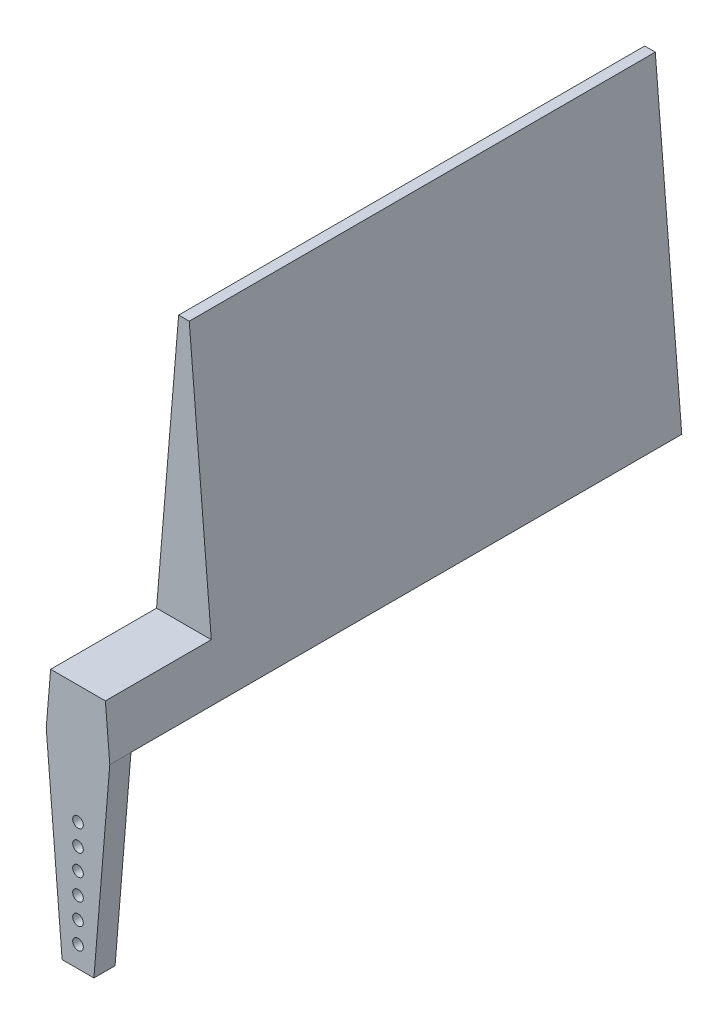
ISO-10303-21;
HEADER;
FILE_DESCRIPTION(('STEP AP214'),'2;1');
FILE_NAME('part.step','',(''),(''),'','','');
FILE_SCHEMA(('AUTOMOTIVE_DESIGN { 1 0 10303 214 1 1 1 1 }'));
ENDSEC;
DATA;
#1=APPLICATION_CONTEXT('core data for automotive mechanical design processes');
#2=APPLICATION_PROTOCOL_DEFINITION('international standard','automotive_design',2000,#1);
#3=PRODUCT_CONTEXT('',#1,'mechanical');
#4=PRODUCT('Part','Part','',(#3));
#5=PRODUCT_RELATED_PRODUCT_CATEGORY('part','',(#4));
#6=PRODUCT_DEFINITION_FORMATION('','',#4);
#7=PRODUCT_DEFINITION_CONTEXT('part definition',#1,'design');
#8=PRODUCT_DEFINITION('design','',#6,#7);
#9=PRODUCT_DEFINITION_SHAPE('','',#8);
#10=(LENGTH_UNIT() NAMED_UNIT(*) SI_UNIT(.MILLI.,.METRE.));
#11=(NAMED_UNIT(*) PLANE_ANGLE_UNIT() SI_UNIT($,.RADIAN.));
#12=(NAMED_UNIT(*) SI_UNIT($,.STERADIAN.) SOLID_ANGLE_UNIT());
#13=UNCERTAINTY_MEASURE_WITH_UNIT(LENGTH_MEASURE(1.E-05),#10,'distance_accuracy_value','');
#14=(GEOMETRIC_REPRESENTATION_CONTEXT(3) GLOBAL_UNCERTAINTY_ASSIGNED_CONTEXT((#13)) GLOBAL_UNIT_ASSIGNED_CONTEXT((#10,
#11,#12)) REPRESENTATION_CONTEXT('',''));
#15=CARTESIAN_POINT('',(0.,0.,0.));
#16=DIRECTION('',(0.,0.,1.));
#17=DIRECTION('',(1.,0.,0.));
#18=AXIS2_PLACEMENT_3D('',#15,#16,#17);
#19=CARTESIAN_POINT('',(60.5722359618717,20.7278633503816,-44.));
#20=DIRECTION('',(0.,-1.,0.));
#21=DIRECTION('',(0.,0.,-1.));
#22=AXIS2_PLACEMENT_3D('',#19,#20,#21);
#23=PLANE('',#22);
#24=DIRECTION('',(0.,0.,1.));
#25=VECTOR('',#24,1.);
#26=CARTESIAN_POINT('',(66.5722359618717,20.7278633503816,-44.));
#27=LINE('',#26,#25);
#28=CARTESIAN_POINT('',(66.5722359618717,20.7278633503816,-44.));
#29=VERTEX_POINT('',#28);
#30=CARTESIAN_POINT('',(66.5722359618717,20.7278633503816,8.));
#31=VERTEX_POINT('',#30);
#32=EDGE_CURVE('E45',#29,#31,#27,.T.);
#33=ORIENTED_EDGE('',*,*,#32,.T.);
#34=DIRECTION('',(-1.,0.,0.));
#35=VECTOR('',#34,1.);
#36=CARTESIAN_POINT('',(66.5722359618717,20.7278633503816,8.));
#37=LINE('',#36,#35);
#38=CARTESIAN_POINT('',(60.5722359618717,20.7278633503816,8.));
#39=VERTEX_POINT('',#38);
#40=EDGE_CURVE('E122',#31,#39,#37,.T.);
#41=ORIENTED_EDGE('',*,*,#40,.T.);
#42=DIRECTION('',(0.,0.,1.));
#43=VECTOR('',#42,1.);
#44=CARTESIAN_POINT('',(60.5722359618717,20.7278633503816,-44.));
#45=LINE('',#44,#43);
#46=CARTESIAN_POINT('',(60.5722359618717,20.7278633503816,-44.));
#47=VERTEX_POINT('',#46);
#48=EDGE_CURVE('E11',#47,#39,#45,.T.);
#49=ORIENTED_EDGE('',*,*,#48,.F.);
#50=DIRECTION('',(1.,0.,0.));
#51=VECTOR('',#50,1.);
#52=CARTESIAN_POINT('',(60.5722359618717,20.7278633503816,-44.));
#53=LINE('',#52,#51);
#54=EDGE_CURVE('E165',#47,#29,#53,.T.);
#55=ORIENTED_EDGE('',*,*,#54,.T.);
#56=EDGE_LOOP('',(#33,#41,#49,#55));
#57=FACE_BOUND('',#56,.T.);
#58=ADVANCED_FACE('F39',(#57),#23,.T.);
#59=CARTESIAN_POINT('',(0.,0.,0.));
#60=DIRECTION('',(0.,0.,-1.));
#61=DIRECTION('',(-1.,0.,0.));
#62=AXIS2_PLACEMENT_3D('',#59,#60,#61);
#63=PLANE('',#62);
#64=DIRECTION('',(-1.,0.,0.));
#65=VECTOR('',#64,1.);
#66=CARTESIAN_POINT('',(60.9889026285384,25.7278633503816,0.));
#67=LINE('',#66,#65);
#68=CARTESIAN_POINT('',(66.1555692952051,25.7278633503816,0.));
#69=VERTEX_POINT('',#68);
#70=CARTESIAN_POINT('',(60.9889026285384,25.7278633503816,0.));
#71=VERTEX_POINT('',#70);
#72=EDGE_CURVE('E64',#69,#71,#67,.T.);
#73=ORIENTED_EDGE('',*,*,#72,.F.);
#74=DIRECTION('',(-0.08304547985374,0.99654575824488,0.));
#75=VECTOR('',#74,1.);
#76=CARTESIAN_POINT('',(64.0722359618717,50.7278633503816,0.));
#77=LINE('',#76,#75);
#78=CARTESIAN_POINT('',(64.0722359618717,50.7278633503816,0.));
#79=VERTEX_POINT('',#78);
#80=EDGE_CURVE('E161',#69,#79,#77,.T.);
#81=ORIENTED_EDGE('',*,*,#80,.T.);
#82=DIRECTION('',(-1.,0.,0.));
#83=VECTOR('',#82,1.);
#84=CARTESIAN_POINT('',(63.0722359618717,50.7278633503816,0.));
#85=LINE('',#84,#83);
#86=CARTESIAN_POINT('',(63.0722359618717,50.7278633503816,0.));
#87=VERTEX_POINT('',#86);
#88=EDGE_CURVE('E178',#79,#87,#85,.T.);
#89=ORIENTED_EDGE('',*,*,#88,.T.);
#90=DIRECTION('',(-0.08304547985374,-0.99654575824488,0.));
#91=VECTOR('',#90,1.);
#92=CARTESIAN_POINT('',(63.0722359618717,50.7278633503816,0.));
#93=LINE('',#92,#91);
#94=EDGE_CURVE('E166',#87,#71,#93,.T.);
#95=ORIENTED_EDGE('',*,*,#94,.T.);
#96=EDGE_LOOP('',(#73,#81,#89,#95));
#97=FACE_BOUND('',#96,.T.);
#98=ADVANCED_FACE('F197',(#97),#63,.F.);
#99=CARTESIAN_POINT('',(63.0722359618717,50.7278633503816,-44.));
#100=DIRECTION('',(-0.99654575824488,0.0830454798537401,0.));
#101=DIRECTION('',(-0.08304547985374,-0.99654575824488,0.));
#102=AXIS2_PLACEMENT_3D('',#99,#100,#101);
#103=PLANE('',#102);
#104=ORIENTED_EDGE('',*,*,#94,.F.);
#105=DIRECTION('',(0.,0.,1.));
#106=VECTOR('',#105,1.);
#107=CARTESIAN_POINT('',(63.0722359618717,50.7278633503816,-44.));
#108=LINE('',#107,#106);
#109=CARTESIAN_POINT('',(63.0722359618717,50.7278633503816,-44.));
#110=VERTEX_POINT('',#109);
#111=EDGE_CURVE('E50',#110,#87,#108,.T.);
#112=ORIENTED_EDGE('',*,*,#111,.F.);
#113=DIRECTION('',(-0.08304547985374,-0.99654575824488,0.));
#114=VECTOR('',#113,1.);
#115=CARTESIAN_POINT('',(63.0722359618717,50.7278633503816,-44.));
#116=LINE('',#115,#114);
#117=EDGE_CURVE('E172',#110,#47,#116,.T.);
#118=ORIENTED_EDGE('',*,*,#117,.T.);
#119=ORIENTED_EDGE('',*,*,#48,.T.);
#120=DIRECTION('',(0.,0.,1.));
#121=VECTOR('',#120,1.);
#122=CARTESIAN_POINT('',(60.5722359618717,20.7278633503816,8.));
#123=LINE('',#122,#121);
#124=CARTESIAN_POINT('',(60.5722359618717,20.7278633503816,10.));
#125=VERTEX_POINT('',#124);
#126=EDGE_CURVE('E126',#39,#125,#123,.T.);
#127=ORIENTED_EDGE('',*,*,#126,.T.);
#128=DIRECTION('',(-0.0830454798537391,-0.99654575824488,0.));
#129=VECTOR('',#128,1.);
#130=CARTESIAN_POINT('',(60.5722359618717,20.7278633503816,10.));
#131=LINE('',#130,#129);
#132=CARTESIAN_POINT('',(60.9889026285384,25.7278633503816,10.));
#133=VERTEX_POINT('',#132);
#134=EDGE_CURVE('E155',#133,#125,#131,.T.);
#135=ORIENTED_EDGE('',*,*,#134,.F.);
#136=DIRECTION('',(0.,0.,-1.));
#137=VECTOR('',#136,1.);
#138=CARTESIAN_POINT('',(60.9889026285384,25.7278633503816,10.));
#139=LINE('',#138,#137);
#140=EDGE_CURVE('E156',#133,#71,#139,.T.);
#141=ORIENTED_EDGE('',*,*,#140,.T.);
#142=EDGE_LOOP('',(#104,#112,#118,#119,#127,#135,#141));
#143=FACE_BOUND('',#142,.T.);
#144=ADVANCED_FACE('F202',(#143),#103,.T.);
#145=CARTESIAN_POINT('',(63.0722359618717,50.7278633503816,-44.));
#146=DIRECTION('',(0.,1.,0.));
#147=DIRECTION('',(-1.,0.,0.));
#148=AXIS2_PLACEMENT_3D('',#145,#146,#147);
#149=PLANE('',#148);
#150=ORIENTED_EDGE('',*,*,#88,.F.);
#151=DIRECTION('',(0.,0.,1.));
#152=VECTOR('',#151,1.);
#153=CARTESIAN_POINT('',(64.0722359618717,50.7278633503816,-44.));
#154=LINE('',#153,#152);
#155=CARTESIAN_POINT('',(64.0722359618717,50.7278633503816,-44.));
#156=VERTEX_POINT('',#155);
#157=EDGE_CURVE('E185',#156,#79,#154,.T.);
#158=ORIENTED_EDGE('',*,*,#157,.F.);
#159=DIRECTION('',(-1.,0.,0.));
#160=VECTOR('',#159,1.);
#161=CARTESIAN_POINT('',(63.0722359618717,50.7278633503816,-44.));
#162=LINE('',#161,#160);
#163=EDGE_CURVE('E171',#156,#110,#162,.T.);
#164=ORIENTED_EDGE('',*,*,#163,.T.);
#165=ORIENTED_EDGE('',*,*,#111,.T.);
#166=EDGE_LOOP('',(#150,#158,#164,#165));
#167=FACE_BOUND('',#166,.T.);
#168=ADVANCED_FACE('F200',(#167),#149,.T.);
#169=CARTESIAN_POINT('',(64.0722359618717,50.7278633503816,-44.));
#170=DIRECTION('',(0.99654575824488,0.08304547985374,0.));
#171=DIRECTION('',(-0.08304547985374,0.99654575824488,0.));
#172=AXIS2_PLACEMENT_3D('',#169,#170,#171);
#173=PLANE('',#172);
#174=ORIENTED_EDGE('',*,*,#80,.F.);
#175=DIRECTION('',(0.,0.,-1.));
#176=VECTOR('',#175,1.);
#177=CARTESIAN_POINT('',(66.1555692952051,25.7278633503816,10.));
#178=LINE('',#177,#176);
#179=CARTESIAN_POINT('',(66.1555692952051,25.7278633503816,10.));
#180=VERTEX_POINT('',#179);
#181=EDGE_CURVE('E160',#180,#69,#178,.T.);
#182=ORIENTED_EDGE('',*,*,#181,.F.);
#183=DIRECTION('',(-0.0830454798537418,0.99654575824488,0.));
#184=VECTOR('',#183,1.);
#185=CARTESIAN_POINT('',(66.1555692952051,25.7278633503816,10.));
#186=LINE('',#185,#184);
#187=CARTESIAN_POINT('',(66.5722359618717,20.7278633503816,10.));
#188=VERTEX_POINT('',#187);
#189=EDGE_CURVE('E146',#188,#180,#186,.T.);
#190=ORIENTED_EDGE('',*,*,#189,.F.);
#191=DIRECTION('',(0.,0.,1.));
#192=VECTOR('',#191,1.);
#193=CARTESIAN_POINT('',(66.5722359618717,20.7278633503816,8.));
#194=LINE('',#193,#192);
#195=EDGE_CURVE('E147',#31,#188,#194,.T.);
#196=ORIENTED_EDGE('',*,*,#195,.F.);
#197=ORIENTED_EDGE('',*,*,#32,.F.);
#198=DIRECTION('',(-0.08304547985374,0.99654575824488,0.));
#199=VECTOR('',#198,1.);
#200=CARTESIAN_POINT('',(64.0722359618717,50.7278633503816,-44.));
#201=LINE('',#200,#199);
#202=EDGE_CURVE('E170',#29,#156,#201,.T.);
#203=ORIENTED_EDGE('',*,*,#202,.T.);
#204=ORIENTED_EDGE('',*,*,#157,.T.);
#205=EDGE_LOOP('',(#174,#182,#190,#196,#197,#203,#204));
#206=FACE_BOUND('',#205,.T.);
#207=ADVANCED_FACE('F192',(#206),#173,.T.);
#208=CARTESIAN_POINT('',(0.,0.,-44.));
#209=DIRECTION('',(0.,0.,-1.));
#210=DIRECTION('',(-1.,0.,0.));
#211=AXIS2_PLACEMENT_3D('',#208,#209,#210);
#212=PLANE('',#211);
#213=ORIENTED_EDGE('',*,*,#54,.F.);
#214=ORIENTED_EDGE('',*,*,#117,.F.);
#215=ORIENTED_EDGE('',*,*,#163,.F.);
#216=ORIENTED_EDGE('',*,*,#202,.F.);
#217=EDGE_LOOP('',(#213,#214,#215,#216));
#218=FACE_BOUND('',#217,.T.);
#219=ADVANCED_FACE('F193',(#218),#212,.T.);
#220=CARTESIAN_POINT('',(60.9889026285384,25.7278633503816,10.));
#221=DIRECTION('',(0.,-1.,0.));
#222=DIRECTION('',(0.,0.,-1.));
#223=AXIS2_PLACEMENT_3D('',#220,#221,#222);
#224=PLANE('',#223);
#225=ORIENTED_EDGE('',*,*,#72,.T.);
#226=ORIENTED_EDGE('',*,*,#140,.F.);
#227=DIRECTION('',(-1.,0.,0.));
#228=VECTOR('',#227,1.);
#229=CARTESIAN_POINT('',(60.9889026285384,25.7278633503816,10.));
#230=LINE('',#229,#228);
#231=EDGE_CURVE('E154',#180,#133,#230,.T.);
#232=ORIENTED_EDGE('',*,*,#231,.F.);
#233=ORIENTED_EDGE('',*,*,#181,.T.);
#234=EDGE_LOOP('',(#225,#226,#232,#233));
#235=FACE_BOUND('',#234,.T.);
#236=ADVANCED_FACE('F210',(#235),#224,.F.);
#237=CARTESIAN_POINT('',(0.,0.,10.));
#238=DIRECTION('',(0.,0.,-1.));
#239=DIRECTION('',(-1.,0.,0.));
#240=AXIS2_PLACEMENT_3D('',#237,#238,#239);
#241=PLANE('',#240);
#242=ORIENTED_EDGE('',*,*,#134,.T.);
#243=DIRECTION('',(0.0821390832087535,-0.996620876266209,0.));
#244=VECTOR('',#243,1.);
#245=CARTESIAN_POINT('',(60.5722359618717,20.7278633503816,10.));
#246=LINE('',#245,#244);
#247=CARTESIAN_POINT('',(62.0722359618717,2.52786335038159,10.));
#248=VERTEX_POINT('',#247);
#249=EDGE_CURVE('E142',#125,#248,#246,.T.);
#250=ORIENTED_EDGE('',*,*,#249,.T.);
#251=DIRECTION('',(1.,0.,0.));
#252=VECTOR('',#251,1.);
#253=CARTESIAN_POINT('',(62.0722359618717,2.52786335038159,10.));
#254=LINE('',#253,#252);
#255=CARTESIAN_POINT('',(65.0722359618717,2.52786335038159,10.));
#256=VERTEX_POINT('',#255);
#257=EDGE_CURVE('E120',#248,#256,#254,.T.);
#258=ORIENTED_EDGE('',*,*,#257,.T.);
#259=DIRECTION('',(0.0821390832087535,0.996620876266209,0.));
#260=VECTOR('',#259,1.);
#261=CARTESIAN_POINT('',(65.0722359618717,2.52786335038159,10.));
#262=LINE('',#261,#260);
#263=EDGE_CURVE('E134',#256,#188,#262,.T.);
#264=ORIENTED_EDGE('',*,*,#263,.T.);
#265=ORIENTED_EDGE('',*,*,#189,.T.);
#266=ORIENTED_EDGE('',*,*,#231,.T.);
#267=EDGE_LOOP('',(#242,#250,#258,#264,#265,#266));
#268=FACE_BOUND('',#267,.T.);
#269=CARTESIAN_POINT('',(63.5722359618717,6.52786335038159,10.));
#270=DIRECTION('',(0.,0.,1.));
#271=DIRECTION('',(-1.,0.,0.));
#272=AXIS2_PLACEMENT_3D('',#269,#270,#271);
#273=CIRCLE('',#272,0.500000000002423);
#274=CARTESIAN_POINT('',(63.0722359618693,6.52786335038159,10.));
#275=VERTEX_POINT('',#274);
#276=EDGE_CURVE('E341',#275,#275,#273,.T.);
#277=ORIENTED_EDGE('',*,*,#276,.F.);
#278=EDGE_LOOP('',(#277));
#279=FACE_BOUND('',#278,.T.);
#280=CARTESIAN_POINT('',(63.5722359618717,4.52786335038159,10.));
#281=DIRECTION('',(0.,0.,1.));
#282=DIRECTION('',(-1.,0.,0.));
#283=AXIS2_PLACEMENT_3D('',#280,#281,#282);
#284=CIRCLE('',#283,0.500000000002423);
#285=CARTESIAN_POINT('',(63.0722359618693,4.52786335038159,10.));
#286=VERTEX_POINT('',#285);
#287=EDGE_CURVE('E349',#286,#286,#284,.T.);
#288=ORIENTED_EDGE('',*,*,#287,.F.);
#289=EDGE_LOOP('',(#288));
#290=FACE_BOUND('',#289,.T.);
#291=CARTESIAN_POINT('',(63.5722359618717,8.52786335038159,10.));
#292=DIRECTION('',(0.,0.,1.));
#293=DIRECTION('',(-1.,0.,0.));
#294=AXIS2_PLACEMENT_3D('',#291,#292,#293);
#295=CIRCLE('',#294,0.500000000002423);
#296=CARTESIAN_POINT('',(63.0722359618693,8.52786335038159,10.));
#297=VERTEX_POINT('',#296);
#298=EDGE_CURVE('E352',#297,#297,#295,.T.);
#299=ORIENTED_EDGE('',*,*,#298,.F.);
#300=EDGE_LOOP('',(#299));
#301=FACE_BOUND('',#300,.T.);
#302=CARTESIAN_POINT('',(63.5722359618717,10.5278633503816,10.));
#303=DIRECTION('',(0.,0.,1.));
#304=DIRECTION('',(-1.,0.,0.));
#305=AXIS2_PLACEMENT_3D('',#302,#303,#304);
#306=CIRCLE('',#305,0.500000000002423);
#307=CARTESIAN_POINT('',(63.0722359618693,10.5278633503816,10.));
#308=VERTEX_POINT('',#307);
#309=EDGE_CURVE('E356',#308,#308,#306,.T.);
#310=ORIENTED_EDGE('',*,*,#309,.F.);
#311=EDGE_LOOP('',(#310));
#312=FACE_BOUND('',#311,.T.);
#313=CARTESIAN_POINT('',(63.5722359618717,12.5278633503816,10.));
#314=DIRECTION('',(0.,0.,1.));
#315=DIRECTION('',(-1.,0.,0.));
#316=AXIS2_PLACEMENT_3D('',#313,#314,#315);
#317=CIRCLE('',#316,0.500000000002423);
#318=CARTESIAN_POINT('',(63.0722359618693,12.5278633503816,10.));
#319=VERTEX_POINT('',#318);
#320=EDGE_CURVE('E364',#319,#319,#317,.T.);
#321=ORIENTED_EDGE('',*,*,#320,.F.);
#322=EDGE_LOOP('',(#321));
#323=FACE_BOUND('',#322,.T.);
#324=CARTESIAN_POINT('',(63.5722359618717,14.5278633503816,10.));
#325=DIRECTION('',(0.,0.,1.));
#326=DIRECTION('',(-1.,0.,0.));
#327=AXIS2_PLACEMENT_3D('',#324,#325,#326);
#328=CIRCLE('',#327,0.500000000002423);
#329=CARTESIAN_POINT('',(63.0722359618693,14.5278633503816,10.));
#330=VERTEX_POINT('',#329);
#331=EDGE_CURVE('E136',#330,#330,#328,.T.);
#332=ORIENTED_EDGE('',*,*,#331,.F.);
#333=EDGE_LOOP('',(#332));
#334=FACE_BOUND('',#333,.T.);
#335=ADVANCED_FACE('F208',(#268,#279,#290,#301,#312,#323,#334),#241,.F.);
#336=CARTESIAN_POINT('',(60.5722359618717,20.7278633503816,8.));
#337=DIRECTION('',(-0.996620876266209,-0.0821390832087535,0.));
#338=DIRECTION('',(0.0821390832087535,-0.996620876266209,0.));
#339=AXIS2_PLACEMENT_3D('',#336,#337,#338);
#340=PLANE('',#339);
#341=ORIENTED_EDGE('',*,*,#249,.F.);
#342=ORIENTED_EDGE('',*,*,#126,.F.);
#343=DIRECTION('',(0.0821390832087535,-0.996620876266209,0.));
#344=VECTOR('',#343,1.);
#345=CARTESIAN_POINT('',(60.5722359618717,20.7278633503816,8.));
#346=LINE('',#345,#344);
#347=CARTESIAN_POINT('',(62.0722359618717,2.52786335038159,8.));
#348=VERTEX_POINT('',#347);
#349=EDGE_CURVE('E54',#39,#348,#346,.T.);
#350=ORIENTED_EDGE('',*,*,#349,.T.);
#351=DIRECTION('',(0.,0.,1.));
#352=VECTOR('',#351,1.);
#353=CARTESIAN_POINT('',(62.0722359618717,2.52786335038159,8.));
#354=LINE('',#353,#352);
#355=EDGE_CURVE('E113',#348,#248,#354,.T.);
#356=ORIENTED_EDGE('',*,*,#355,.T.);
#357=EDGE_LOOP('',(#341,#342,#350,#356));
#358=FACE_BOUND('',#357,.T.);
#359=ADVANCED_FACE('F130',(#358),#340,.T.);
#360=CARTESIAN_POINT('',(65.0722359618717,2.52786335038159,8.));
#361=DIRECTION('',(0.996620876266209,-0.0821390832087535,0.));
#362=DIRECTION('',(0.0821390832087535,0.996620876266209,0.));
#363=AXIS2_PLACEMENT_3D('',#360,#361,#362);
#364=PLANE('',#363);
#365=ORIENTED_EDGE('',*,*,#263,.F.);
#366=DIRECTION('',(0.,0.,1.));
#367=VECTOR('',#366,1.);
#368=CARTESIAN_POINT('',(65.0722359618717,2.52786335038159,8.));
#369=LINE('',#368,#367);
#370=CARTESIAN_POINT('',(65.0722359618717,2.52786335038159,8.));
#371=VERTEX_POINT('',#370);
#372=EDGE_CURVE('E119',#371,#256,#369,.T.);
#373=ORIENTED_EDGE('',*,*,#372,.F.);
#374=DIRECTION('',(0.0821390832087535,0.996620876266209,0.));
#375=VECTOR('',#374,1.);
#376=CARTESIAN_POINT('',(65.0722359618717,2.52786335038159,8.));
#377=LINE('',#376,#375);
#378=EDGE_CURVE('E123',#371,#31,#377,.T.);
#379=ORIENTED_EDGE('',*,*,#378,.T.);
#380=ORIENTED_EDGE('',*,*,#195,.T.);
#381=EDGE_LOOP('',(#365,#373,#379,#380));
#382=FACE_BOUND('',#381,.T.);
#383=ADVANCED_FACE('F211',(#382),#364,.T.);
#384=CARTESIAN_POINT('',(62.0722359618717,2.52786335038159,8.));
#385=DIRECTION('',(0.,-1.,0.));
#386=DIRECTION('',(1.,0.,0.));
#387=AXIS2_PLACEMENT_3D('',#384,#385,#386);
#388=PLANE('',#387);
#389=ORIENTED_EDGE('',*,*,#257,.F.);
#390=ORIENTED_EDGE('',*,*,#355,.F.);
#391=DIRECTION('',(1.,0.,0.));
#392=VECTOR('',#391,1.);
#393=CARTESIAN_POINT('',(62.0722359618717,2.52786335038159,8.));
#394=LINE('',#393,#392);
#395=EDGE_CURVE('E114',#348,#371,#394,.T.);
#396=ORIENTED_EDGE('',*,*,#395,.T.);
#397=ORIENTED_EDGE('',*,*,#372,.T.);
#398=EDGE_LOOP('',(#389,#390,#396,#397));
#399=FACE_BOUND('',#398,.T.);
#400=ADVANCED_FACE('F112',(#399),#388,.T.);
#401=CARTESIAN_POINT('',(0.,0.,8.));
#402=DIRECTION('',(0.,0.,1.));
#403=DIRECTION('',(1.,0.,0.));
#404=AXIS2_PLACEMENT_3D('',#401,#402,#403);
#405=PLANE('',#404);
#406=CARTESIAN_POINT('',(63.5722359618717,6.52786335038159,8.));
#407=DIRECTION('',(0.,0.,1.));
#408=DIRECTION('',(-1.,0.,0.));
#409=AXIS2_PLACEMENT_3D('',#406,#407,#408);
#410=CIRCLE('',#409,0.500000000002423);
#411=CARTESIAN_POINT('',(63.0722359618693,6.52786335038159,8.));
#412=VERTEX_POINT('',#411);
#413=EDGE_CURVE('E342',#412,#412,#410,.T.);
#414=ORIENTED_EDGE('',*,*,#413,.T.);
#415=EDGE_LOOP('',(#414));
#416=FACE_BOUND('',#415,.T.);
#417=CARTESIAN_POINT('',(63.5722359618717,4.52786335038159,8.));
#418=DIRECTION('',(0.,0.,1.));
#419=DIRECTION('',(-1.,0.,0.));
#420=AXIS2_PLACEMENT_3D('',#417,#418,#419);
#421=CIRCLE('',#420,0.500000000002423);
#422=CARTESIAN_POINT('',(63.0722359618693,4.52786335038159,8.));
#423=VERTEX_POINT('',#422);
#424=EDGE_CURVE('E348',#423,#423,#421,.T.);
#425=ORIENTED_EDGE('',*,*,#424,.T.);
#426=EDGE_LOOP('',(#425));
#427=FACE_BOUND('',#426,.T.);
#428=CARTESIAN_POINT('',(63.5722359618717,8.52786335038159,8.));
#429=DIRECTION('',(0.,0.,1.));
#430=DIRECTION('',(-1.,0.,0.));
#431=AXIS2_PLACEMENT_3D('',#428,#429,#430);
#432=CIRCLE('',#431,0.500000000002423);
#433=CARTESIAN_POINT('',(63.0722359618693,8.52786335038159,8.));
#434=VERTEX_POINT('',#433);
#435=EDGE_CURVE('E355',#434,#434,#432,.T.);
#436=ORIENTED_EDGE('',*,*,#435,.T.);
#437=EDGE_LOOP('',(#436));
#438=FACE_BOUND('',#437,.T.);
#439=CARTESIAN_POINT('',(63.5722359618717,10.5278633503816,8.));
#440=DIRECTION('',(0.,0.,1.));
#441=DIRECTION('',(-1.,0.,0.));
#442=AXIS2_PLACEMENT_3D('',#439,#440,#441);
#443=CIRCLE('',#442,0.500000000002423);
#444=CARTESIAN_POINT('',(63.0722359618693,10.5278633503816,8.));
#445=VERTEX_POINT('',#444);
#446=EDGE_CURVE('E363',#445,#445,#443,.T.);
#447=ORIENTED_EDGE('',*,*,#446,.T.);
#448=EDGE_LOOP('',(#447));
#449=FACE_BOUND('',#448,.T.);
#450=CARTESIAN_POINT('',(63.5722359618717,12.5278633503816,8.));
#451=DIRECTION('',(0.,0.,1.));
#452=DIRECTION('',(-1.,0.,0.));
#453=AXIS2_PLACEMENT_3D('',#450,#451,#452);
#454=CIRCLE('',#453,0.500000000002423);
#455=CARTESIAN_POINT('',(63.0722359618693,12.5278633503816,8.));
#456=VERTEX_POINT('',#455);
#457=EDGE_CURVE('E370',#456,#456,#454,.T.);
#458=ORIENTED_EDGE('',*,*,#457,.T.);
#459=EDGE_LOOP('',(#458));
#460=FACE_BOUND('',#459,.T.);
#461=CARTESIAN_POINT('',(63.5722359618717,14.5278633503816,8.));
#462=DIRECTION('',(0.,0.,1.));
#463=DIRECTION('',(-1.,0.,0.));
#464=AXIS2_PLACEMENT_3D('',#461,#462,#463);
#465=CIRCLE('',#464,0.500000000002423);
#466=CARTESIAN_POINT('',(63.0722359618693,14.5278633503816,8.));
#467=VERTEX_POINT('',#466);
#468=EDGE_CURVE('E141',#467,#467,#465,.T.);
#469=ORIENTED_EDGE('',*,*,#468,.T.);
#470=EDGE_LOOP('',(#469));
#471=FACE_BOUND('',#470,.T.);
#472=ORIENTED_EDGE('',*,*,#349,.F.);
#473=ORIENTED_EDGE('',*,*,#40,.F.);
#474=ORIENTED_EDGE('',*,*,#378,.F.);
#475=ORIENTED_EDGE('',*,*,#395,.F.);
#476=EDGE_LOOP('',(#472,#473,#474,#475));
#477=FACE_BOUND('',#476,.T.);
#478=ADVANCED_FACE('F121',(#416,#427,#438,#449,#460,#471,#477),#405,.F.);
#479=CARTESIAN_POINT('',(63.5722359618717,14.5278633503816,8.));
#480=DIRECTION('',(0.,0.,1.));
#481=DIRECTION('',(1.,0.,0.));
#482=AXIS2_PLACEMENT_3D('',#479,#480,#481);
#483=CYLINDRICAL_SURFACE('',#482,0.500000000002423);
#484=ORIENTED_EDGE('',*,*,#468,.F.);
#485=EDGE_LOOP('',(#484));
#486=FACE_BOUND('',#485,.T.);
#487=ORIENTED_EDGE('',*,*,#331,.T.);
#488=EDGE_LOOP('',(#487));
#489=FACE_BOUND('',#488,.T.);
#490=ADVANCED_FACE('F277',(#486,#489),#483,.F.);
#491=CARTESIAN_POINT('',(63.5722359618717,12.5278633503816,8.));
#492=DIRECTION('',(0.,0.,1.));
#493=DIRECTION('',(1.,0.,0.));
#494=AXIS2_PLACEMENT_3D('',#491,#492,#493);
#495=CYLINDRICAL_SURFACE('',#494,0.500000000002423);
#496=ORIENTED_EDGE('',*,*,#457,.F.);
#497=EDGE_LOOP('',(#496));
#498=FACE_BOUND('',#497,.T.);
#499=ORIENTED_EDGE('',*,*,#320,.T.);
#500=EDGE_LOOP('',(#499));
#501=FACE_BOUND('',#500,.T.);
#502=ADVANCED_FACE('F282',(#498,#501),#495,.F.);
#503=CARTESIAN_POINT('',(63.5722359618717,10.5278633503816,8.));
#504=DIRECTION('',(0.,0.,1.));
#505=DIRECTION('',(1.,0.,0.));
#506=AXIS2_PLACEMENT_3D('',#503,#504,#505);
#507=CYLINDRICAL_SURFACE('',#506,0.500000000002423);
#508=ORIENTED_EDGE('',*,*,#446,.F.);
#509=EDGE_LOOP('',(#508));
#510=FACE_BOUND('',#509,.T.);
#511=ORIENTED_EDGE('',*,*,#309,.T.);
#512=EDGE_LOOP('',(#511));
#513=FACE_BOUND('',#512,.T.);
#514=ADVANCED_FACE('F294',(#510,#513),#507,.F.);
#515=CARTESIAN_POINT('',(63.5722359618717,8.52786335038159,8.));
#516=DIRECTION('',(0.,0.,1.));
#517=DIRECTION('',(1.,0.,0.));
#518=AXIS2_PLACEMENT_3D('',#515,#516,#517);
#519=CYLINDRICAL_SURFACE('',#518,0.500000000002423);
#520=ORIENTED_EDGE('',*,*,#435,.F.);
#521=EDGE_LOOP('',(#520));
#522=FACE_BOUND('',#521,.T.);
#523=ORIENTED_EDGE('',*,*,#298,.T.);
#524=EDGE_LOOP('',(#523));
#525=FACE_BOUND('',#524,.T.);
#526=ADVANCED_FACE('F304',(#522,#525),#519,.F.);
#527=CARTESIAN_POINT('',(63.5722359618717,4.52786335038159,8.));
#528=DIRECTION('',(0.,0.,1.));
#529=DIRECTION('',(1.,0.,0.));
#530=AXIS2_PLACEMENT_3D('',#527,#528,#529);
#531=CYLINDRICAL_SURFACE('',#530,0.500000000002423);
#532=ORIENTED_EDGE('',*,*,#424,.F.);
#533=EDGE_LOOP('',(#532));
#534=FACE_BOUND('',#533,.T.);
#535=ORIENTED_EDGE('',*,*,#287,.T.);
#536=EDGE_LOOP('',(#535));
#537=FACE_BOUND('',#536,.T.);
#538=ADVANCED_FACE('F314',(#534,#537),#531,.F.);
#539=CARTESIAN_POINT('',(63.5722359618717,6.52786335038159,8.));
#540=DIRECTION('',(0.,0.,1.));
#541=DIRECTION('',(1.,0.,0.));
#542=AXIS2_PLACEMENT_3D('',#539,#540,#541);
#543=CYLINDRICAL_SURFACE('',#542,0.500000000002423);
#544=ORIENTED_EDGE('',*,*,#413,.F.);
#545=EDGE_LOOP('',(#544));
#546=FACE_BOUND('',#545,.T.);
#547=ORIENTED_EDGE('',*,*,#276,.T.);
#548=EDGE_LOOP('',(#547));
#549=FACE_BOUND('',#548,.T.);
#550=ADVANCED_FACE('F323',(#546,#549),#543,.F.);
#551=CLOSED_SHELL('',(#58,#98,#144,#168,#207,#219,#236,#335,#359,#383,#400,#478,#490,#502,#514,
#526,#538,#550));
#552=MANIFOLD_SOLID_BREP('B2',#551);
#553=ADVANCED_BREP_SHAPE_REPRESENTATION('',(#18,#552),#14);
#554=SHAPE_DEFINITION_REPRESENTATION(#9,#553);
ENDSEC;
END-ISO-10303-21;
